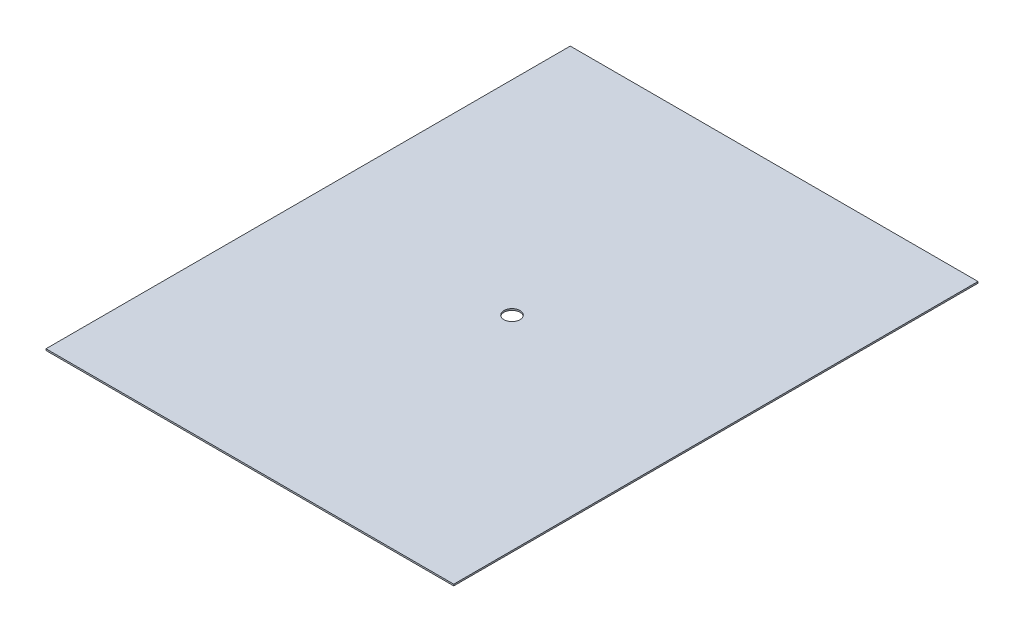
ISO-10303-21;
HEADER;
FILE_DESCRIPTION(('STEP AP214'),'2;1');
FILE_NAME('part.step','',(''),(''),'','','');
FILE_SCHEMA(('AUTOMOTIVE_DESIGN { 1 0 10303 214 1 1 1 1 }'));
ENDSEC;
DATA;
#1=APPLICATION_CONTEXT('core data for automotive mechanical design processes');
#2=APPLICATION_PROTOCOL_DEFINITION('international standard','automotive_design',2000,#1);
#3=PRODUCT_CONTEXT('',#1,'mechanical');
#4=PRODUCT('Part','Part','',(#3));
#5=PRODUCT_RELATED_PRODUCT_CATEGORY('part','',(#4));
#6=PRODUCT_DEFINITION_FORMATION('','',#4);
#7=PRODUCT_DEFINITION_CONTEXT('part definition',#1,'design');
#8=PRODUCT_DEFINITION('design','',#6,#7);
#9=PRODUCT_DEFINITION_SHAPE('','',#8);
#10=(LENGTH_UNIT() NAMED_UNIT(*) SI_UNIT(.MILLI.,.METRE.));
#11=(NAMED_UNIT(*) PLANE_ANGLE_UNIT() SI_UNIT($,.RADIAN.));
#12=(NAMED_UNIT(*) SI_UNIT($,.STERADIAN.) SOLID_ANGLE_UNIT());
#13=UNCERTAINTY_MEASURE_WITH_UNIT(LENGTH_MEASURE(1.E-05),#10,'distance_accuracy_value','');
#14=(GEOMETRIC_REPRESENTATION_CONTEXT(3) GLOBAL_UNCERTAINTY_ASSIGNED_CONTEXT((#13)) GLOBAL_UNIT_ASSIGNED_CONTEXT((#10,
#11,#12)) REPRESENTATION_CONTEXT('',''));
#15=CARTESIAN_POINT('',(0.,0.,0.));
#16=DIRECTION('',(0.,0.,1.));
#17=DIRECTION('',(1.,0.,0.));
#18=AXIS2_PLACEMENT_3D('',#15,#16,#17);
#19=CARTESIAN_POINT('',(0.,0.762,0.));
#20=DIRECTION('',(0.,-1.,0.));
#21=DIRECTION('',(0.,0.,-1.));
#22=AXIS2_PLACEMENT_3D('',#19,#20,#21);
#23=PLANE('',#22);
#24=DIRECTION('',(0.,0.,1.));
#25=VECTOR('',#24,1.);
#26=CARTESIAN_POINT('',(-100.0125,0.762,-128.5875));
#27=LINE('',#26,#25);
#28=CARTESIAN_POINT('',(-100.0125,0.762,-128.5875));
#29=VERTEX_POINT('',#28);
#30=CARTESIAN_POINT('',(-100.0125,0.762,128.5875));
#31=VERTEX_POINT('',#30);
#32=EDGE_CURVE('E92',#29,#31,#27,.T.);
#33=ORIENTED_EDGE('',*,*,#32,.T.);
#34=DIRECTION('',(1.,0.,0.));
#35=VECTOR('',#34,1.);
#36=CARTESIAN_POINT('',(100.0125,0.762,128.5875));
#37=LINE('',#36,#35);
#38=CARTESIAN_POINT('',(100.0125,0.762,128.5875));
#39=VERTEX_POINT('',#38);
#40=EDGE_CURVE('E87',#31,#39,#37,.T.);
#41=ORIENTED_EDGE('',*,*,#40,.T.);
#42=DIRECTION('',(0.,0.,-1.));
#43=VECTOR('',#42,1.);
#44=CARTESIAN_POINT('',(100.0125,0.762,-128.5875));
#45=LINE('',#44,#43);
#46=CARTESIAN_POINT('',(100.0125,0.762,-128.5875));
#47=VERTEX_POINT('',#46);
#48=EDGE_CURVE('E90',#39,#47,#45,.T.);
#49=ORIENTED_EDGE('',*,*,#48,.T.);
#50=DIRECTION('',(-1.,0.,0.));
#51=VECTOR('',#50,1.);
#52=CARTESIAN_POINT('',(100.0125,0.762,-128.5875));
#53=LINE('',#52,#51);
#54=EDGE_CURVE('E57',#47,#29,#53,.T.);
#55=ORIENTED_EDGE('',*,*,#54,.T.);
#56=EDGE_LOOP('',(#33,#41,#49,#55));
#57=FACE_BOUND('',#56,.T.);
#58=CARTESIAN_POINT('',(0.,0.762,0.));
#59=DIRECTION('',(0.,1.,0.));
#60=DIRECTION('',(0.,0.,1.));
#61=AXIS2_PLACEMENT_3D('',#58,#59,#60);
#62=CIRCLE('',#61,3.9116);
#63=CARTESIAN_POINT('',(0.,0.762,-3.9116));
#64=VERTEX_POINT('',#63);
#65=EDGE_CURVE('E112',#64,#64,#62,.T.);
#66=ORIENTED_EDGE('',*,*,#65,.F.);
#67=EDGE_LOOP('',(#66));
#68=FACE_BOUND('',#67,.T.);
#69=ADVANCED_FACE('F39',(#57,#68),#23,.F.);
#70=CARTESIAN_POINT('',(0.,0.,0.));
#71=DIRECTION('',(0.,-1.,0.));
#72=DIRECTION('',(0.,0.,-1.));
#73=AXIS2_PLACEMENT_3D('',#70,#71,#72);
#74=PLANE('',#73);
#75=DIRECTION('',(0.,0.,1.));
#76=VECTOR('',#75,1.);
#77=CARTESIAN_POINT('',(-100.0125,0.,-128.5875));
#78=LINE('',#77,#76);
#79=CARTESIAN_POINT('',(-100.0125,0.,-128.5875));
#80=VERTEX_POINT('',#79);
#81=CARTESIAN_POINT('',(-100.0125,0.,128.5875));
#82=VERTEX_POINT('',#81);
#83=EDGE_CURVE('E108',#80,#82,#78,.T.);
#84=ORIENTED_EDGE('',*,*,#83,.F.);
#85=DIRECTION('',(-1.,0.,0.));
#86=VECTOR('',#85,1.);
#87=CARTESIAN_POINT('',(100.0125,0.,-128.5875));
#88=LINE('',#87,#86);
#89=CARTESIAN_POINT('',(100.0125,0.,-128.5875));
#90=VERTEX_POINT('',#89);
#91=EDGE_CURVE('E80',#90,#80,#88,.T.);
#92=ORIENTED_EDGE('',*,*,#91,.F.);
#93=DIRECTION('',(0.,0.,-1.));
#94=VECTOR('',#93,1.);
#95=CARTESIAN_POINT('',(100.0125,0.,-128.5875));
#96=LINE('',#95,#94);
#97=CARTESIAN_POINT('',(100.0125,0.,128.5875));
#98=VERTEX_POINT('',#97);
#99=EDGE_CURVE('E74',#98,#90,#96,.T.);
#100=ORIENTED_EDGE('',*,*,#99,.F.);
#101=DIRECTION('',(1.,0.,0.));
#102=VECTOR('',#101,1.);
#103=CARTESIAN_POINT('',(100.0125,0.,128.5875));
#104=LINE('',#103,#102);
#105=EDGE_CURVE('E97',#82,#98,#104,.T.);
#106=ORIENTED_EDGE('',*,*,#105,.F.);
#107=EDGE_LOOP('',(#84,#92,#100,#106));
#108=FACE_BOUND('',#107,.T.);
#109=CARTESIAN_POINT('',(0.,0.,0.));
#110=DIRECTION('',(0.,1.,0.));
#111=DIRECTION('',(0.,0.,1.));
#112=AXIS2_PLACEMENT_3D('',#109,#110,#111);
#113=CIRCLE('',#112,3.9116);
#114=CARTESIAN_POINT('',(0.,0.,-3.9116));
#115=VERTEX_POINT('',#114);
#116=EDGE_CURVE('E130',#115,#115,#113,.T.);
#117=ORIENTED_EDGE('',*,*,#116,.T.);
#118=EDGE_LOOP('',(#117));
#119=FACE_BOUND('',#118,.T.);
#120=ADVANCED_FACE('F125',(#108,#119),#74,.T.);
#121=CARTESIAN_POINT('',(-100.0125,0.762,-128.5875));
#122=DIRECTION('',(1.,0.,0.));
#123=DIRECTION('',(0.,0.,-1.));
#124=AXIS2_PLACEMENT_3D('',#121,#122,#123);
#125=PLANE('',#124);
#126=ORIENTED_EDGE('',*,*,#83,.T.);
#127=DIRECTION('',(0.,-1.,0.));
#128=VECTOR('',#127,1.);
#129=CARTESIAN_POINT('',(-100.0125,0.762,128.5875));
#130=LINE('',#129,#128);
#131=EDGE_CURVE('E11',#31,#82,#130,.T.);
#132=ORIENTED_EDGE('',*,*,#131,.F.);
#133=ORIENTED_EDGE('',*,*,#32,.F.);
#134=DIRECTION('',(0.,-1.,0.));
#135=VECTOR('',#134,1.);
#136=CARTESIAN_POINT('',(-100.0125,0.762,-128.5875));
#137=LINE('',#136,#135);
#138=EDGE_CURVE('E104',#29,#80,#137,.T.);
#139=ORIENTED_EDGE('',*,*,#138,.T.);
#140=EDGE_LOOP('',(#126,#132,#133,#139));
#141=FACE_BOUND('',#140,.T.);
#142=ADVANCED_FACE('F41',(#141),#125,.F.);
#143=CARTESIAN_POINT('',(100.0125,0.762,128.5875));
#144=DIRECTION('',(0.,0.,-1.));
#145=DIRECTION('',(-1.,0.,0.));
#146=AXIS2_PLACEMENT_3D('',#143,#144,#145);
#147=PLANE('',#146);
#148=ORIENTED_EDGE('',*,*,#105,.T.);
#149=DIRECTION('',(0.,-1.,0.));
#150=VECTOR('',#149,1.);
#151=CARTESIAN_POINT('',(100.0125,0.762,128.5875));
#152=LINE('',#151,#150);
#153=EDGE_CURVE('E49',#39,#98,#152,.T.);
#154=ORIENTED_EDGE('',*,*,#153,.F.);
#155=ORIENTED_EDGE('',*,*,#40,.F.);
#156=ORIENTED_EDGE('',*,*,#131,.T.);
#157=EDGE_LOOP('',(#148,#154,#155,#156));
#158=FACE_BOUND('',#157,.T.);
#159=ADVANCED_FACE('F96',(#158),#147,.F.);
#160=CARTESIAN_POINT('',(100.0125,0.762,-128.5875));
#161=DIRECTION('',(-1.,0.,0.));
#162=DIRECTION('',(0.,0.,1.));
#163=AXIS2_PLACEMENT_3D('',#160,#161,#162);
#164=PLANE('',#163);
#165=ORIENTED_EDGE('',*,*,#99,.T.);
#166=DIRECTION('',(0.,-1.,0.));
#167=VECTOR('',#166,1.);
#168=CARTESIAN_POINT('',(100.0125,0.762,-128.5875));
#169=LINE('',#168,#167);
#170=EDGE_CURVE('E99',#47,#90,#169,.T.);
#171=ORIENTED_EDGE('',*,*,#170,.F.);
#172=ORIENTED_EDGE('',*,*,#48,.F.);
#173=ORIENTED_EDGE('',*,*,#153,.T.);
#174=EDGE_LOOP('',(#165,#171,#172,#173));
#175=FACE_BOUND('',#174,.T.);
#176=ADVANCED_FACE('F100',(#175),#164,.F.);
#177=CARTESIAN_POINT('',(100.0125,0.762,-128.5875));
#178=DIRECTION('',(0.,0.,1.));
#179=DIRECTION('',(1.,0.,0.));
#180=AXIS2_PLACEMENT_3D('',#177,#178,#179);
#181=PLANE('',#180);
#182=ORIENTED_EDGE('',*,*,#91,.T.);
#183=ORIENTED_EDGE('',*,*,#138,.F.);
#184=ORIENTED_EDGE('',*,*,#54,.F.);
#185=ORIENTED_EDGE('',*,*,#170,.T.);
#186=EDGE_LOOP('',(#182,#183,#184,#185));
#187=FACE_BOUND('',#186,.T.);
#188=ADVANCED_FACE('F122',(#187),#181,.F.);
#189=CARTESIAN_POINT('',(0.,0.762,0.));
#190=DIRECTION('',(0.,-1.,0.));
#191=DIRECTION('',(0.,0.,-1.));
#192=AXIS2_PLACEMENT_3D('',#189,#190,#191);
#193=CYLINDRICAL_SURFACE('',#192,3.9116);
#194=CARTESIAN_POINT('',(0.,0.762,-3.9116));
#195=CARTESIAN_POINT('',(0.,0.7540625,-3.9116));
#196=CARTESIAN_POINT('',(0.,0.746125,-3.9116));
#197=CARTESIAN_POINT('',(0.,0.73025,-3.9116));
#198=CARTESIAN_POINT('',(0.,0.7223125,-3.9116));
#199=CARTESIAN_POINT('',(0.,0.7064375,-3.9116));
#200=CARTESIAN_POINT('',(0.,0.6985,-3.9116));
#201=CARTESIAN_POINT('',(0.,0.682625,-3.9116));
#202=CARTESIAN_POINT('',(0.,0.6746875,-3.9116));
#203=CARTESIAN_POINT('',(0.,0.6588125,-3.9116));
#204=CARTESIAN_POINT('',(0.,0.650875,-3.9116));
#205=CARTESIAN_POINT('',(0.,0.635,-3.9116));
#206=CARTESIAN_POINT('',(0.,0.6270625,-3.9116));
#207=CARTESIAN_POINT('',(0.,0.6111875,-3.9116));
#208=CARTESIAN_POINT('',(0.,0.60325,-3.9116));
#209=CARTESIAN_POINT('',(0.,0.587375,-3.9116));
#210=CARTESIAN_POINT('',(0.,0.5794375,-3.9116));
#211=CARTESIAN_POINT('',(0.,0.5635625,-3.9116));
#212=CARTESIAN_POINT('',(0.,0.555625,-3.9116));
#213=CARTESIAN_POINT('',(0.,0.53975,-3.9116));
#214=CARTESIAN_POINT('',(0.,0.5318125,-3.9116));
#215=CARTESIAN_POINT('',(0.,0.5159375,-3.9116));
#216=CARTESIAN_POINT('',(0.,0.508,-3.9116));
#217=CARTESIAN_POINT('',(0.,0.492125,-3.9116));
#218=CARTESIAN_POINT('',(0.,0.4841875,-3.9116));
#219=CARTESIAN_POINT('',(0.,0.4683125,-3.9116));
#220=CARTESIAN_POINT('',(0.,0.460375,-3.9116));
#221=CARTESIAN_POINT('',(0.,0.4445,-3.9116));
#222=CARTESIAN_POINT('',(0.,0.4365625,-3.9116));
#223=CARTESIAN_POINT('',(0.,0.4206875,-3.9116));
#224=CARTESIAN_POINT('',(0.,0.41275,-3.9116));
#225=CARTESIAN_POINT('',(0.,0.396875,-3.9116));
#226=CARTESIAN_POINT('',(0.,0.3889375,-3.9116));
#227=CARTESIAN_POINT('',(0.,0.3730625,-3.9116));
#228=CARTESIAN_POINT('',(0.,0.365125,-3.9116));
#229=CARTESIAN_POINT('',(0.,0.34925,-3.9116));
#230=CARTESIAN_POINT('',(0.,0.3413125,-3.9116));
#231=CARTESIAN_POINT('',(0.,0.3254375,-3.9116));
#232=CARTESIAN_POINT('',(0.,0.3175,-3.9116));
#233=CARTESIAN_POINT('',(0.,0.301625,-3.9116));
#234=CARTESIAN_POINT('',(0.,0.2936875,-3.9116));
#235=CARTESIAN_POINT('',(0.,0.2778125,-3.9116));
#236=CARTESIAN_POINT('',(0.,0.269875,-3.9116));
#237=CARTESIAN_POINT('',(0.,0.254,-3.9116));
#238=CARTESIAN_POINT('',(0.,0.2460625,-3.9116));
#239=CARTESIAN_POINT('',(0.,0.2301875,-3.9116));
#240=CARTESIAN_POINT('',(0.,0.22225,-3.9116));
#241=CARTESIAN_POINT('',(0.,0.206375,-3.9116));
#242=CARTESIAN_POINT('',(0.,0.1984375,-3.9116));
#243=CARTESIAN_POINT('',(0.,0.1825625,-3.9116));
#244=CARTESIAN_POINT('',(0.,0.174625,-3.9116));
#245=CARTESIAN_POINT('',(0.,0.15875,-3.9116));
#246=CARTESIAN_POINT('',(0.,0.1508125,-3.9116));
#247=CARTESIAN_POINT('',(0.,0.1349375,-3.9116));
#248=CARTESIAN_POINT('',(0.,0.127,-3.9116));
#249=CARTESIAN_POINT('',(0.,0.111125,-3.9116));
#250=CARTESIAN_POINT('',(0.,0.1031875,-3.9116));
#251=CARTESIAN_POINT('',(0.,0.0873125,-3.9116));
#252=CARTESIAN_POINT('',(0.,0.079375,-3.9116));
#253=CARTESIAN_POINT('',(0.,0.0635,-3.9116));
#254=CARTESIAN_POINT('',(0.,0.0555625,-3.9116));
#255=CARTESIAN_POINT('',(0.,0.0396875,-3.9116));
#256=CARTESIAN_POINT('',(0.,0.03175,-3.9116));
#257=CARTESIAN_POINT('',(0.,0.015875,-3.9116));
#258=CARTESIAN_POINT('',(0.,0.00793749999999999,-3.9116));
#259=CARTESIAN_POINT('',(0.,0.,-3.9116));
#260=B_SPLINE_CURVE_WITH_KNOTS('',3,(#194,#195,#196,#197,#198,#199,#200,#201,#202,#203,#204,
#205,#206,#207,#208,#209,#210,#211,#212,#213,#214,#215,#216,#217,#218,#219,#220,#221,#222,#223,
#224,#225,#226,#227,#228,#229,#230,#231,#232,#233,#234,#235,#236,#237,#238,#239,#240,#241,#242,
#243,#244,#245,#246,#247,#248,#249,#250,#251,#252,#253,#254,#255,#256,#257,#258,#259),
.UNSPECIFIED.,.F.,.F.,(4,2,2,2,2,2,2,2,2,2,2,2,2,2,2,2,2,2,2,2,2,2,2,2,2,2,2,2,2,2,2,2,4),(0.,
0.0238125000000001,0.047625,0.0714375,0.0952500000000001,0.1190625,0.142875,0.1666875,0.1905,
0.2143125,0.238125,0.2619375,0.28575,0.3095625,0.333375,0.3571875,0.381,0.4048125,0.428625,
0.4524375,0.47625,0.5000625,0.523875,0.5476875,0.5715,0.5953125,0.619125,0.6429375,0.66675,
0.6905625,0.714375,0.7381875,0.762),.UNSPECIFIED.);
#261=EDGE_CURVE('BSEAM138',#64,#115,#260,.T.);
#262=ORIENTED_EDGE('',*,*,#65,.T.);
#263=ORIENTED_EDGE('',*,*,#116,.F.);
#264=ORIENTED_EDGE('',*,*,#261,.T.);
#265=ORIENTED_EDGE('',*,*,#261,.F.);
#266=EDGE_LOOP('',(#262,#264,#263,#265));
#267=FACE_BOUND('',#266,.T.);
#268=ADVANCED_FACE('F138',(#267),#193,.F.);
#269=CLOSED_SHELL('',(#69,#120,#142,#159,#176,#188,#268));
#270=MANIFOLD_SOLID_BREP('B2',#269);
#271=ADVANCED_BREP_SHAPE_REPRESENTATION('',(#18,#270),#14);
#272=SHAPE_DEFINITION_REPRESENTATION(#9,#271);
ENDSEC;
END-ISO-10303-21;
